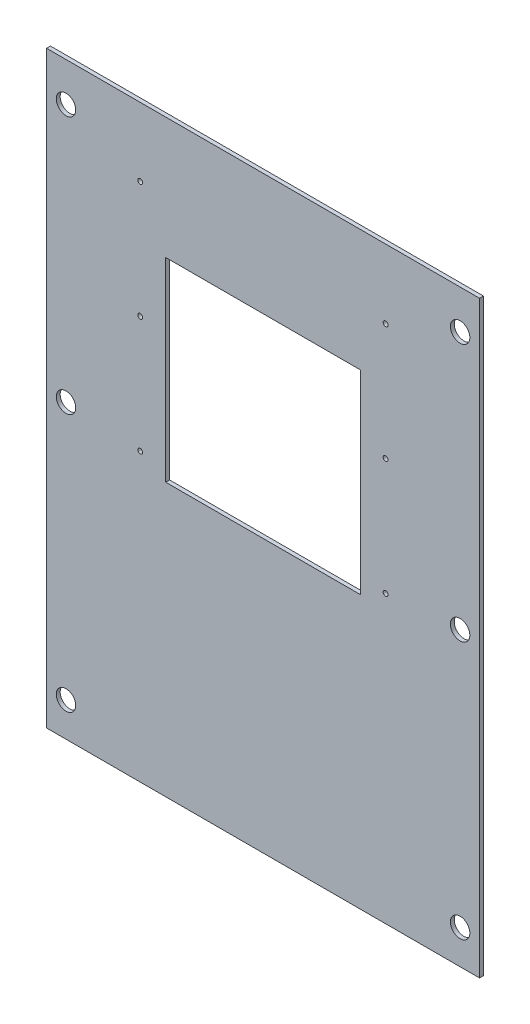
ISO-10303-21;
HEADER;
FILE_DESCRIPTION(('STEP AP214'),'2;1');
FILE_NAME('part.step','',(''),(''),'','','');
FILE_SCHEMA(('AUTOMOTIVE_DESIGN { 1 0 10303 214 1 1 1 1 }'));
ENDSEC;
DATA;
#1=APPLICATION_CONTEXT('core data for automotive mechanical design processes');
#2=APPLICATION_PROTOCOL_DEFINITION('international standard','automotive_design',2000,#1);
#3=PRODUCT_CONTEXT('',#1,'mechanical');
#4=PRODUCT('Part','Part','',(#3));
#5=PRODUCT_RELATED_PRODUCT_CATEGORY('part','',(#4));
#6=PRODUCT_DEFINITION_FORMATION('','',#4);
#7=PRODUCT_DEFINITION_CONTEXT('part definition',#1,'design');
#8=PRODUCT_DEFINITION('design','',#6,#7);
#9=PRODUCT_DEFINITION_SHAPE('','',#8);
#10=(LENGTH_UNIT() NAMED_UNIT(*) SI_UNIT(.MILLI.,.METRE.));
#11=(NAMED_UNIT(*) PLANE_ANGLE_UNIT() SI_UNIT($,.RADIAN.));
#12=(NAMED_UNIT(*) SI_UNIT($,.STERADIAN.) SOLID_ANGLE_UNIT());
#13=UNCERTAINTY_MEASURE_WITH_UNIT(LENGTH_MEASURE(1.E-05),#10,'distance_accuracy_value','');
#14=(GEOMETRIC_REPRESENTATION_CONTEXT(3) GLOBAL_UNCERTAINTY_ASSIGNED_CONTEXT((#13)) GLOBAL_UNIT_ASSIGNED_CONTEXT((#10,
#11,#12)) REPRESENTATION_CONTEXT('',''));
#15=CARTESIAN_POINT('',(0.,0.,0.));
#16=DIRECTION('',(0.,0.,1.));
#17=DIRECTION('',(1.,0.,0.));
#18=AXIS2_PLACEMENT_3D('',#15,#16,#17);
#19=CARTESIAN_POINT('',(141.2875,0.,2.54));
#20=DIRECTION('',(1.,0.,0.));
#21=DIRECTION('',(0.,1.,0.));
#22=AXIS2_PLACEMENT_3D('',#19,#20,#21);
#23=PLANE('',#22);
#24=DIRECTION('',(0.,-1.,0.));
#25=VECTOR('',#24,1.);
#26=CARTESIAN_POINT('',(141.2875,0.,0.));
#27=LINE('',#26,#25);
#28=CARTESIAN_POINT('',(141.2875,192.0875,0.));
#29=VERTEX_POINT('',#28);
#30=CARTESIAN_POINT('',(141.2875,-192.0875,0.));
#31=VERTEX_POINT('',#30);
#32=EDGE_CURVE('E190',#29,#31,#27,.T.);
#33=ORIENTED_EDGE('',*,*,#32,.F.);
#34=DIRECTION('',(0.,0.,-1.));
#35=VECTOR('',#34,1.);
#36=CARTESIAN_POINT('',(141.2875,192.0875,2.54));
#37=LINE('',#36,#35);
#38=CARTESIAN_POINT('',(141.2875,192.0875,2.54));
#39=VERTEX_POINT('',#38);
#40=EDGE_CURVE('E11',#39,#29,#37,.T.);
#41=ORIENTED_EDGE('',*,*,#40,.F.);
#42=DIRECTION('',(0.,-1.,0.));
#43=VECTOR('',#42,1.);
#44=CARTESIAN_POINT('',(141.2875,0.,2.54));
#45=LINE('',#44,#43);
#46=CARTESIAN_POINT('',(141.2875,-192.0875,2.54));
#47=VERTEX_POINT('',#46);
#48=EDGE_CURVE('E134',#39,#47,#45,.T.);
#49=ORIENTED_EDGE('',*,*,#48,.T.);
#50=DIRECTION('',(0.,0.,-1.));
#51=VECTOR('',#50,1.);
#52=CARTESIAN_POINT('',(141.2875,-192.0875,2.54));
#53=LINE('',#52,#51);
#54=EDGE_CURVE('E94',#47,#31,#53,.T.);
#55=ORIENTED_EDGE('',*,*,#54,.T.);
#56=EDGE_LOOP('',(#33,#41,#49,#55));
#57=FACE_BOUND('',#56,.T.);
#58=ADVANCED_FACE('F40',(#57),#23,.T.);
#59=CARTESIAN_POINT('',(0.,192.0875,2.54));
#60=DIRECTION('',(0.,1.,0.));
#61=DIRECTION('',(0.,0.,1.));
#62=AXIS2_PLACEMENT_3D('',#59,#60,#61);
#63=PLANE('',#62);
#64=DIRECTION('',(1.,0.,0.));
#65=VECTOR('',#64,1.);
#66=CARTESIAN_POINT('',(0.,192.0875,0.));
#67=LINE('',#66,#65);
#68=CARTESIAN_POINT('',(-141.2875,192.0875,0.));
#69=VERTEX_POINT('',#68);
#70=EDGE_CURVE('E123',#69,#29,#67,.T.);
#71=ORIENTED_EDGE('',*,*,#70,.F.);
#72=DIRECTION('',(0.,0.,-1.));
#73=VECTOR('',#72,1.);
#74=CARTESIAN_POINT('',(-141.2875,192.0875,2.54));
#75=LINE('',#74,#73);
#76=CARTESIAN_POINT('',(-141.2875,192.0875,2.54));
#77=VERTEX_POINT('',#76);
#78=EDGE_CURVE('E50',#77,#69,#75,.T.);
#79=ORIENTED_EDGE('',*,*,#78,.F.);
#80=DIRECTION('',(1.,0.,0.));
#81=VECTOR('',#80,1.);
#82=CARTESIAN_POINT('',(0.,192.0875,2.54));
#83=LINE('',#82,#81);
#84=EDGE_CURVE('E121',#77,#39,#83,.T.);
#85=ORIENTED_EDGE('',*,*,#84,.T.);
#86=ORIENTED_EDGE('',*,*,#40,.T.);
#87=EDGE_LOOP('',(#71,#79,#85,#86));
#88=FACE_BOUND('',#87,.T.);
#89=ADVANCED_FACE('F119',(#88),#63,.T.);
#90=CARTESIAN_POINT('',(-141.2875,0.,2.54));
#91=DIRECTION('',(1.,0.,0.));
#92=DIRECTION('',(0.,1.,0.));
#93=AXIS2_PLACEMENT_3D('',#90,#91,#92);
#94=PLANE('',#93);
#95=DIRECTION('',(0.,-1.,0.));
#96=VECTOR('',#95,1.);
#97=CARTESIAN_POINT('',(-141.2875,0.,0.));
#98=LINE('',#97,#96);
#99=CARTESIAN_POINT('',(-141.2875,-192.0875,0.));
#100=VERTEX_POINT('',#99);
#101=EDGE_CURVE('E193',#69,#100,#98,.T.);
#102=ORIENTED_EDGE('',*,*,#101,.T.);
#103=DIRECTION('',(0.,0.,-1.));
#104=VECTOR('',#103,1.);
#105=CARTESIAN_POINT('',(-141.2875,-192.0875,2.54));
#106=LINE('',#105,#104);
#107=CARTESIAN_POINT('',(-141.2875,-192.0875,2.54));
#108=VERTEX_POINT('',#107);
#109=EDGE_CURVE('E126',#108,#100,#106,.T.);
#110=ORIENTED_EDGE('',*,*,#109,.F.);
#111=DIRECTION('',(0.,-1.,0.));
#112=VECTOR('',#111,1.);
#113=CARTESIAN_POINT('',(-141.2875,0.,2.54));
#114=LINE('',#113,#112);
#115=EDGE_CURVE('E129',#77,#108,#114,.T.);
#116=ORIENTED_EDGE('',*,*,#115,.F.);
#117=ORIENTED_EDGE('',*,*,#78,.T.);
#118=EDGE_LOOP('',(#102,#110,#116,#117));
#119=FACE_BOUND('',#118,.T.);
#120=ADVANCED_FACE('F130',(#119),#94,.F.);
#121=CARTESIAN_POINT('',(0.,112.7125,2.54));
#122=DIRECTION('',(0.,1.,0.));
#123=DIRECTION('',(0.,0.,1.));
#124=AXIS2_PLACEMENT_3D('',#121,#122,#123);
#125=PLANE('',#124);
#126=DIRECTION('',(1.,0.,0.));
#127=VECTOR('',#126,1.);
#128=CARTESIAN_POINT('',(0.,112.7125,0.));
#129=LINE('',#128,#127);
#130=CARTESIAN_POINT('',(-63.5064023109508,112.7125,0.));
#131=VERTEX_POINT('',#130);
#132=CARTESIAN_POINT('',(63.4935976890492,112.7125,0.));
#133=VERTEX_POINT('',#132);
#134=EDGE_CURVE('E178',#131,#133,#129,.T.);
#135=ORIENTED_EDGE('',*,*,#134,.T.);
#136=DIRECTION('',(0.,0.,-1.));
#137=VECTOR('',#136,1.);
#138=CARTESIAN_POINT('',(63.4935976890492,112.7125,2.54));
#139=LINE('',#138,#137);
#140=CARTESIAN_POINT('',(63.4935976890492,112.7125,2.54));
#141=VERTEX_POINT('',#140);
#142=EDGE_CURVE('E44',#141,#133,#139,.T.);
#143=ORIENTED_EDGE('',*,*,#142,.F.);
#144=DIRECTION('',(1.,0.,0.));
#145=VECTOR('',#144,1.);
#146=CARTESIAN_POINT('',(0.,112.7125,2.54));
#147=LINE('',#146,#145);
#148=CARTESIAN_POINT('',(-63.5064023109508,112.7125,2.54));
#149=VERTEX_POINT('',#148);
#150=EDGE_CURVE('E547',#149,#141,#147,.T.);
#151=ORIENTED_EDGE('',*,*,#150,.F.);
#152=DIRECTION('',(0.,0.,-1.));
#153=VECTOR('',#152,1.);
#154=CARTESIAN_POINT('',(-63.5064023109508,112.7125,2.54));
#155=LINE('',#154,#153);
#156=EDGE_CURVE('E156',#149,#131,#155,.T.);
#157=ORIENTED_EDGE('',*,*,#156,.T.);
#158=EDGE_LOOP('',(#135,#143,#151,#157));
#159=FACE_BOUND('',#158,.T.);
#160=ADVANCED_FACE('F225',(#159),#125,.F.);
#161=CARTESIAN_POINT('',(63.4935976890493,0.,2.54));
#162=DIRECTION('',(1.,0.,0.));
#163=DIRECTION('',(0.,1.,0.));
#164=AXIS2_PLACEMENT_3D('',#161,#162,#163);
#165=PLANE('',#164);
#166=DIRECTION('',(0.,-1.,0.));
#167=VECTOR('',#166,1.);
#168=CARTESIAN_POINT('',(63.4935976890493,0.,0.));
#169=LINE('',#168,#167);
#170=CARTESIAN_POINT('',(63.4935976890493,-14.2875,0.));
#171=VERTEX_POINT('',#170);
#172=EDGE_CURVE('E181',#133,#171,#169,.T.);
#173=ORIENTED_EDGE('',*,*,#172,.T.);
#174=DIRECTION('',(0.,0.,-1.));
#175=VECTOR('',#174,1.);
#176=CARTESIAN_POINT('',(63.4935976890493,-14.2875,2.54));
#177=LINE('',#176,#175);
#178=CARTESIAN_POINT('',(63.4935976890493,-14.2875,2.54));
#179=VERTEX_POINT('',#178);
#180=EDGE_CURVE('E216',#179,#171,#177,.T.);
#181=ORIENTED_EDGE('',*,*,#180,.F.);
#182=DIRECTION('',(0.,-1.,0.));
#183=VECTOR('',#182,1.);
#184=CARTESIAN_POINT('',(63.4935976890493,0.,2.54));
#185=LINE('',#184,#183);
#186=EDGE_CURVE('E102',#141,#179,#185,.T.);
#187=ORIENTED_EDGE('',*,*,#186,.F.);
#188=ORIENTED_EDGE('',*,*,#142,.T.);
#189=EDGE_LOOP('',(#173,#181,#187,#188));
#190=FACE_BOUND('',#189,.T.);
#191=ADVANCED_FACE('F221',(#190),#165,.F.);
#192=CARTESIAN_POINT('',(0.,-14.2875,2.54));
#193=DIRECTION('',(0.,1.,0.));
#194=DIRECTION('',(0.,0.,1.));
#195=AXIS2_PLACEMENT_3D('',#192,#193,#194);
#196=PLANE('',#195);
#197=DIRECTION('',(1.,0.,0.));
#198=VECTOR('',#197,1.);
#199=CARTESIAN_POINT('',(0.,-14.2875,0.));
#200=LINE('',#199,#198);
#201=CARTESIAN_POINT('',(-63.5064023109508,-14.2875,0.));
#202=VERTEX_POINT('',#201);
#203=EDGE_CURVE('E184',#202,#171,#200,.T.);
#204=ORIENTED_EDGE('',*,*,#203,.F.);
#205=DIRECTION('',(0.,0.,-1.));
#206=VECTOR('',#205,1.);
#207=CARTESIAN_POINT('',(-63.5064023109508,-14.2875,2.54));
#208=LINE('',#207,#206);
#209=CARTESIAN_POINT('',(-63.5064023109508,-14.2875,2.54));
#210=VERTEX_POINT('',#209);
#211=EDGE_CURVE('E215',#210,#202,#208,.T.);
#212=ORIENTED_EDGE('',*,*,#211,.F.);
#213=DIRECTION('',(1.,0.,0.));
#214=VECTOR('',#213,1.);
#215=CARTESIAN_POINT('',(0.,-14.2875,2.54));
#216=LINE('',#215,#214);
#217=EDGE_CURVE('E549',#210,#179,#216,.T.);
#218=ORIENTED_EDGE('',*,*,#217,.T.);
#219=ORIENTED_EDGE('',*,*,#180,.T.);
#220=EDGE_LOOP('',(#204,#212,#218,#219));
#221=FACE_BOUND('',#220,.T.);
#222=ADVANCED_FACE('F234',(#221),#196,.T.);
#223=CARTESIAN_POINT('',(128.5875,-1.58749999999996,2.54));
#224=DIRECTION('',(0.,0.,-1.));
#225=DIRECTION('',(-1.,0.,0.));
#226=AXIS2_PLACEMENT_3D('',#223,#224,#225);
#227=CYLINDRICAL_SURFACE('',#226,6.35);
#228=CARTESIAN_POINT('',(128.5875,-1.58749999999996,2.54));
#229=DIRECTION('',(0.,0.,1.));
#230=DIRECTION('',(1.,0.,0.));
#231=AXIS2_PLACEMENT_3D('',#228,#229,#230);
#232=CIRCLE('',#231,6.35);
#233=CARTESIAN_POINT('',(134.9375,-1.58749999999996,2.54));
#234=VERTEX_POINT('',#233);
#235=EDGE_CURVE('E150',#234,#234,#232,.F.);
#236=ORIENTED_EDGE('',*,*,#235,.F.);
#237=EDGE_LOOP('',(#236));
#238=FACE_BOUND('',#237,.T.);
#239=CARTESIAN_POINT('',(128.5875,-1.58749999999996,0.));
#240=DIRECTION('',(0.,0.,1.));
#241=DIRECTION('',(1.,0.,0.));
#242=AXIS2_PLACEMENT_3D('',#239,#240,#241);
#243=CIRCLE('',#242,6.35);
#244=CARTESIAN_POINT('',(134.9375,-1.58749999999996,0.));
#245=VERTEX_POINT('',#244);
#246=EDGE_CURVE('E205',#245,#245,#243,.F.);
#247=ORIENTED_EDGE('',*,*,#246,.T.);
#248=EDGE_LOOP('',(#247));
#249=FACE_BOUND('',#248,.T.);
#250=ADVANCED_FACE('F236',(#238,#249),#227,.F.);
#251=CARTESIAN_POINT('',(-128.5875,-169.8625,2.54));
#252=DIRECTION('',(0.,0.,-1.));
#253=DIRECTION('',(-1.,0.,0.));
#254=AXIS2_PLACEMENT_3D('',#251,#252,#253);
#255=CYLINDRICAL_SURFACE('',#254,6.34999999999999);
#256=CARTESIAN_POINT('',(-128.5875,-169.8625,2.54));
#257=DIRECTION('',(0.,0.,1.));
#258=DIRECTION('',(1.,0.,0.));
#259=AXIS2_PLACEMENT_3D('',#256,#257,#258);
#260=CIRCLE('',#259,6.34999999999999);
#261=CARTESIAN_POINT('',(-122.2375,-169.8625,2.54));
#262=VERTEX_POINT('',#261);
#263=EDGE_CURVE('E147',#262,#262,#260,.T.);
#264=ORIENTED_EDGE('',*,*,#263,.T.);
#265=EDGE_LOOP('',(#264));
#266=FACE_BOUND('',#265,.T.);
#267=CARTESIAN_POINT('',(-128.5875,-169.8625,0.));
#268=DIRECTION('',(0.,0.,1.));
#269=DIRECTION('',(1.,0.,0.));
#270=AXIS2_PLACEMENT_3D('',#267,#268,#269);
#271=CIRCLE('',#270,6.34999999999999);
#272=CARTESIAN_POINT('',(-122.2375,-169.8625,0.));
#273=VERTEX_POINT('',#272);
#274=EDGE_CURVE('E202',#273,#273,#271,.T.);
#275=ORIENTED_EDGE('',*,*,#274,.F.);
#276=EDGE_LOOP('',(#275));
#277=FACE_BOUND('',#276,.T.);
#278=ADVANCED_FACE('F242',(#266,#277),#255,.F.);
#279=CARTESIAN_POINT('',(-128.5875,-1.58750000000002,2.54));
#280=DIRECTION('',(0.,0.,-1.));
#281=DIRECTION('',(-1.,0.,0.));
#282=AXIS2_PLACEMENT_3D('',#279,#280,#281);
#283=CYLINDRICAL_SURFACE('',#282,6.35);
#284=CARTESIAN_POINT('',(-128.5875,-1.58750000000002,2.54));
#285=DIRECTION('',(0.,0.,1.));
#286=DIRECTION('',(1.,0.,0.));
#287=AXIS2_PLACEMENT_3D('',#284,#285,#286);
#288=CIRCLE('',#287,6.35);
#289=CARTESIAN_POINT('',(-122.2375,-1.58750000000002,2.54));
#290=VERTEX_POINT('',#289);
#291=EDGE_CURVE('E144',#290,#290,#288,.T.);
#292=ORIENTED_EDGE('',*,*,#291,.T.);
#293=EDGE_LOOP('',(#292));
#294=FACE_BOUND('',#293,.T.);
#295=CARTESIAN_POINT('',(-128.5875,-1.58750000000002,0.));
#296=DIRECTION('',(0.,0.,1.));
#297=DIRECTION('',(1.,0.,0.));
#298=AXIS2_PLACEMENT_3D('',#295,#296,#297);
#299=CIRCLE('',#298,6.35);
#300=CARTESIAN_POINT('',(-122.2375,-1.58750000000002,0.));
#301=VERTEX_POINT('',#300);
#302=EDGE_CURVE('E199',#301,#301,#299,.T.);
#303=ORIENTED_EDGE('',*,*,#302,.F.);
#304=EDGE_LOOP('',(#303));
#305=FACE_BOUND('',#304,.T.);
#306=ADVANCED_FACE('F270',(#294,#305),#283,.F.);
#307=CARTESIAN_POINT('',(-128.5875,166.6875,2.54));
#308=DIRECTION('',(0.,0.,-1.));
#309=DIRECTION('',(-1.,0.,0.));
#310=AXIS2_PLACEMENT_3D('',#307,#308,#309);
#311=CYLINDRICAL_SURFACE('',#310,6.34999999999999);
#312=CARTESIAN_POINT('',(-128.5875,166.6875,2.54));
#313=DIRECTION('',(0.,0.,1.));
#314=DIRECTION('',(1.,0.,0.));
#315=AXIS2_PLACEMENT_3D('',#312,#313,#314);
#316=CIRCLE('',#315,6.34999999999999);
#317=CARTESIAN_POINT('',(-122.2375,166.6875,2.54));
#318=VERTEX_POINT('',#317);
#319=EDGE_CURVE('E141',#318,#318,#316,.T.);
#320=ORIENTED_EDGE('',*,*,#319,.T.);
#321=EDGE_LOOP('',(#320));
#322=FACE_BOUND('',#321,.T.);
#323=CARTESIAN_POINT('',(-128.5875,166.6875,0.));
#324=DIRECTION('',(0.,0.,1.));
#325=DIRECTION('',(1.,0.,0.));
#326=AXIS2_PLACEMENT_3D('',#323,#324,#325);
#327=CIRCLE('',#326,6.34999999999999);
#328=CARTESIAN_POINT('',(-122.2375,166.6875,0.));
#329=VERTEX_POINT('',#328);
#330=EDGE_CURVE('E196',#329,#329,#327,.T.);
#331=ORIENTED_EDGE('',*,*,#330,.F.);
#332=EDGE_LOOP('',(#331));
#333=FACE_BOUND('',#332,.T.);
#334=ADVANCED_FACE('F264',(#322,#333),#311,.F.);
#335=CARTESIAN_POINT('',(0.,-192.0875,2.54));
#336=DIRECTION('',(0.,1.,0.));
#337=DIRECTION('',(0.,0.,1.));
#338=AXIS2_PLACEMENT_3D('',#335,#336,#337);
#339=PLANE('',#338);
#340=DIRECTION('',(1.,0.,0.));
#341=VECTOR('',#340,1.);
#342=CARTESIAN_POINT('',(0.,-192.0875,0.));
#343=LINE('',#342,#341);
#344=EDGE_CURVE('E87',#100,#31,#343,.T.);
#345=ORIENTED_EDGE('',*,*,#344,.T.);
#346=ORIENTED_EDGE('',*,*,#54,.F.);
#347=DIRECTION('',(1.,0.,0.));
#348=VECTOR('',#347,1.);
#349=CARTESIAN_POINT('',(0.,-192.0875,2.54));
#350=LINE('',#349,#348);
#351=EDGE_CURVE('E59',#108,#47,#350,.T.);
#352=ORIENTED_EDGE('',*,*,#351,.F.);
#353=ORIENTED_EDGE('',*,*,#109,.T.);
#354=EDGE_LOOP('',(#345,#346,#352,#353));
#355=FACE_BOUND('',#354,.T.);
#356=ADVANCED_FACE('F256',(#355),#339,.F.);
#357=CARTESIAN_POINT('',(-63.5064023109508,0.,2.54));
#358=DIRECTION('',(1.,0.,0.));
#359=DIRECTION('',(0.,0.,-1.));
#360=AXIS2_PLACEMENT_3D('',#357,#358,#359);
#361=PLANE('',#360);
#362=DIRECTION('',(0.,-1.,0.));
#363=VECTOR('',#362,1.);
#364=CARTESIAN_POINT('',(-63.5064023109508,0.,0.));
#365=LINE('',#364,#363);
#366=EDGE_CURVE('E187',#131,#202,#365,.T.);
#367=ORIENTED_EDGE('',*,*,#366,.F.);
#368=ORIENTED_EDGE('',*,*,#156,.F.);
#369=DIRECTION('',(0.,-1.,0.));
#370=VECTOR('',#369,1.);
#371=CARTESIAN_POINT('',(-63.5064023109508,0.,2.54));
#372=LINE('',#371,#370);
#373=EDGE_CURVE('E136',#149,#210,#372,.T.);
#374=ORIENTED_EDGE('',*,*,#373,.T.);
#375=ORIENTED_EDGE('',*,*,#211,.T.);
#376=EDGE_LOOP('',(#367,#368,#374,#375));
#377=FACE_BOUND('',#376,.T.);
#378=ADVANCED_FACE('F230',(#377),#361,.T.);
#379=CARTESIAN_POINT('',(128.5875,166.6875,2.54));
#380=DIRECTION('',(0.,0.,-1.));
#381=DIRECTION('',(-1.,0.,0.));
#382=AXIS2_PLACEMENT_3D('',#379,#380,#381);
#383=CYLINDRICAL_SURFACE('',#382,6.34999999999999);
#384=CARTESIAN_POINT('',(128.5875,166.6875,2.54));
#385=DIRECTION('',(0.,0.,1.));
#386=DIRECTION('',(1.,0.,0.));
#387=AXIS2_PLACEMENT_3D('',#384,#385,#386);
#388=CIRCLE('',#387,6.34999999999999);
#389=CARTESIAN_POINT('',(134.9375,166.6875,2.54));
#390=VERTEX_POINT('',#389);
#391=EDGE_CURVE('E546',#390,#390,#388,.F.);
#392=ORIENTED_EDGE('',*,*,#391,.F.);
#393=EDGE_LOOP('',(#392));
#394=FACE_BOUND('',#393,.T.);
#395=CARTESIAN_POINT('',(128.5875,166.6875,0.));
#396=DIRECTION('',(0.,0.,1.));
#397=DIRECTION('',(1.,0.,0.));
#398=AXIS2_PLACEMENT_3D('',#395,#396,#397);
#399=CIRCLE('',#398,6.34999999999999);
#400=CARTESIAN_POINT('',(134.9375,166.6875,0.));
#401=VERTEX_POINT('',#400);
#402=EDGE_CURVE('E175',#401,#401,#399,.F.);
#403=ORIENTED_EDGE('',*,*,#402,.T.);
#404=EDGE_LOOP('',(#403));
#405=FACE_BOUND('',#404,.T.);
#406=ADVANCED_FACE('F255',(#394,#405),#383,.F.);
#407=CARTESIAN_POINT('',(-80.1751523109518,147.376386757124,2.54));
#408=DIRECTION('',(0.,0.,-1.));
#409=DIRECTION('',(-1.,0.,0.));
#410=AXIS2_PLACEMENT_3D('',#407,#408,#409);
#411=CYLINDRICAL_SURFACE('',#410,1.58750000005452);
#412=CARTESIAN_POINT('',(-80.1751523109518,147.376386757124,2.54));
#413=DIRECTION('',(0.,0.,1.));
#414=DIRECTION('',(1.,0.,0.));
#415=AXIS2_PLACEMENT_3D('',#412,#413,#414);
#416=CIRCLE('',#415,1.58750000005452);
#417=CARTESIAN_POINT('',(-78.5876523108973,147.376386757124,2.54));
#418=VERTEX_POINT('',#417);
#419=EDGE_CURVE('E542',#418,#418,#416,.T.);
#420=ORIENTED_EDGE('',*,*,#419,.T.);
#421=EDGE_LOOP('',(#420));
#422=FACE_BOUND('',#421,.T.);
#423=CARTESIAN_POINT('',(-80.1751523109518,147.376386757124,0.));
#424=DIRECTION('',(0.,0.,1.));
#425=DIRECTION('',(1.,0.,0.));
#426=AXIS2_PLACEMENT_3D('',#423,#424,#425);
#427=CIRCLE('',#426,1.58750000005452);
#428=CARTESIAN_POINT('',(-78.5876523108973,147.376386757124,0.));
#429=VERTEX_POINT('',#428);
#430=EDGE_CURVE('E172',#429,#429,#427,.T.);
#431=ORIENTED_EDGE('',*,*,#430,.F.);
#432=EDGE_LOOP('',(#431));
#433=FACE_BOUND('',#432,.T.);
#434=ADVANCED_FACE('F261',(#422,#433),#411,.F.);
#435=CARTESIAN_POINT('',(-80.1751523109513,71.1763867571244,2.54));
#436=DIRECTION('',(0.,0.,-1.));
#437=DIRECTION('',(-1.,0.,0.));
#438=AXIS2_PLACEMENT_3D('',#435,#436,#437);
#439=CYLINDRICAL_SURFACE('',#438,1.5875000000545);
#440=CARTESIAN_POINT('',(-80.1751523109513,71.1763867571244,2.54));
#441=DIRECTION('',(0.,0.,1.));
#442=DIRECTION('',(1.,0.,0.));
#443=AXIS2_PLACEMENT_3D('',#440,#441,#442);
#444=CIRCLE('',#443,1.5875000000545);
#445=CARTESIAN_POINT('',(-78.5876523108968,71.1763867571244,2.54));
#446=VERTEX_POINT('',#445);
#447=EDGE_CURVE('E538',#446,#446,#444,.T.);
#448=ORIENTED_EDGE('',*,*,#447,.T.);
#449=EDGE_LOOP('',(#448));
#450=FACE_BOUND('',#449,.T.);
#451=CARTESIAN_POINT('',(-80.1751523109513,71.1763867571244,0.));
#452=DIRECTION('',(0.,0.,1.));
#453=DIRECTION('',(1.,0.,0.));
#454=AXIS2_PLACEMENT_3D('',#451,#452,#453);
#455=CIRCLE('',#454,1.5875000000545);
#456=CARTESIAN_POINT('',(-78.5876523108968,71.1763867571244,0.));
#457=VERTEX_POINT('',#456);
#458=EDGE_CURVE('E169',#457,#457,#455,.T.);
#459=ORIENTED_EDGE('',*,*,#458,.F.);
#460=EDGE_LOOP('',(#459));
#461=FACE_BOUND('',#460,.T.);
#462=ADVANCED_FACE('F284',(#450,#461),#439,.F.);
#463=CARTESIAN_POINT('',(-80.1751523109507,-5.02361324287556,2.54));
#464=DIRECTION('',(0.,0.,-1.));
#465=DIRECTION('',(-1.,0.,0.));
#466=AXIS2_PLACEMENT_3D('',#463,#464,#465);
#467=CYLINDRICAL_SURFACE('',#466,1.58750000005448);
#468=CARTESIAN_POINT('',(-80.1751523109507,-5.02361324287556,2.54));
#469=DIRECTION('',(0.,0.,1.));
#470=DIRECTION('',(1.,0.,0.));
#471=AXIS2_PLACEMENT_3D('',#468,#469,#470);
#472=CIRCLE('',#471,1.58750000005448);
#473=CARTESIAN_POINT('',(-78.5876523108962,-5.02361324287556,2.54));
#474=VERTEX_POINT('',#473);
#475=EDGE_CURVE('E534',#474,#474,#472,.T.);
#476=ORIENTED_EDGE('',*,*,#475,.T.);
#477=EDGE_LOOP('',(#476));
#478=FACE_BOUND('',#477,.T.);
#479=CARTESIAN_POINT('',(-80.1751523109507,-5.02361324287556,0.));
#480=DIRECTION('',(0.,0.,1.));
#481=DIRECTION('',(1.,0.,0.));
#482=AXIS2_PLACEMENT_3D('',#479,#480,#481);
#483=CIRCLE('',#482,1.58750000005448);
#484=CARTESIAN_POINT('',(-78.5876523108962,-5.02361324287556,0.));
#485=VERTEX_POINT('',#484);
#486=EDGE_CURVE('E166',#485,#485,#483,.T.);
#487=ORIENTED_EDGE('',*,*,#486,.F.);
#488=EDGE_LOOP('',(#487));
#489=FACE_BOUND('',#488,.T.);
#490=ADVANCED_FACE('F288',(#478,#489),#467,.F.);
#491=CARTESIAN_POINT('',(79.9706504994258,-5.39516449430694,2.54));
#492=DIRECTION('',(0.,0.,-1.));
#493=DIRECTION('',(-1.,0.,0.));
#494=AXIS2_PLACEMENT_3D('',#491,#492,#493);
#495=CYLINDRICAL_SURFACE('',#494,1.58749999999999);
#496=CARTESIAN_POINT('',(79.9706504994258,-5.39516449430694,2.54));
#497=DIRECTION('',(0.,0.,1.));
#498=DIRECTION('',(1.,0.,0.));
#499=AXIS2_PLACEMENT_3D('',#496,#497,#498);
#500=CIRCLE('',#499,1.58749999999999);
#501=CARTESIAN_POINT('',(81.5581504994258,-5.39516449430694,2.54));
#502=VERTEX_POINT('',#501);
#503=EDGE_CURVE('E530',#502,#502,#500,.T.);
#504=ORIENTED_EDGE('',*,*,#503,.T.);
#505=EDGE_LOOP('',(#504));
#506=FACE_BOUND('',#505,.T.);
#507=CARTESIAN_POINT('',(79.9706504994258,-5.39516449430694,0.));
#508=DIRECTION('',(0.,0.,1.));
#509=DIRECTION('',(1.,0.,0.));
#510=AXIS2_PLACEMENT_3D('',#507,#508,#509);
#511=CIRCLE('',#510,1.58749999999999);
#512=CARTESIAN_POINT('',(81.5581504994258,-5.39516449430694,0.));
#513=VERTEX_POINT('',#512);
#514=EDGE_CURVE('E163',#513,#513,#511,.T.);
#515=ORIENTED_EDGE('',*,*,#514,.F.);
#516=EDGE_LOOP('',(#515));
#517=FACE_BOUND('',#516,.T.);
#518=ADVANCED_FACE('F292',(#506,#517),#495,.F.);
#519=CARTESIAN_POINT('',(79.9706504994258,70.804835505693,2.54));
#520=DIRECTION('',(0.,0.,-1.));
#521=DIRECTION('',(-1.,0.,0.));
#522=AXIS2_PLACEMENT_3D('',#519,#520,#521);
#523=CYLINDRICAL_SURFACE('',#522,1.58749999999999);
#524=CARTESIAN_POINT('',(79.9706504994258,70.804835505693,2.54));
#525=DIRECTION('',(0.,0.,1.));
#526=DIRECTION('',(1.,0.,0.));
#527=AXIS2_PLACEMENT_3D('',#524,#525,#526);
#528=CIRCLE('',#527,1.58749999999999);
#529=CARTESIAN_POINT('',(81.5581504994258,70.804835505693,2.54));
#530=VERTEX_POINT('',#529);
#531=EDGE_CURVE('E307',#530,#530,#528,.T.);
#532=ORIENTED_EDGE('',*,*,#531,.T.);
#533=EDGE_LOOP('',(#532));
#534=FACE_BOUND('',#533,.T.);
#535=CARTESIAN_POINT('',(79.9706504994258,70.804835505693,0.));
#536=DIRECTION('',(0.,0.,1.));
#537=DIRECTION('',(1.,0.,0.));
#538=AXIS2_PLACEMENT_3D('',#535,#536,#537);
#539=CIRCLE('',#538,1.58749999999999);
#540=CARTESIAN_POINT('',(81.5581504994258,70.804835505693,0.));
#541=VERTEX_POINT('',#540);
#542=EDGE_CURVE('E160',#541,#541,#539,.T.);
#543=ORIENTED_EDGE('',*,*,#542,.F.);
#544=EDGE_LOOP('',(#543));
#545=FACE_BOUND('',#544,.T.);
#546=ADVANCED_FACE('F295',(#534,#545),#523,.F.);
#547=CARTESIAN_POINT('',(79.9706504994258,147.004835505693,2.54));
#548=DIRECTION('',(0.,0.,-1.));
#549=DIRECTION('',(-1.,0.,0.));
#550=AXIS2_PLACEMENT_3D('',#547,#548,#549);
#551=CYLINDRICAL_SURFACE('',#550,1.58749999999999);
#552=CARTESIAN_POINT('',(79.9706504994258,147.004835505693,2.54));
#553=DIRECTION('',(0.,0.,1.));
#554=DIRECTION('',(1.,0.,0.));
#555=AXIS2_PLACEMENT_3D('',#552,#553,#554);
#556=CIRCLE('',#555,1.58749999999999);
#557=CARTESIAN_POINT('',(81.5581504994258,147.004835505693,2.54));
#558=VERTEX_POINT('',#557);
#559=EDGE_CURVE('E211',#558,#558,#556,.T.);
#560=ORIENTED_EDGE('',*,*,#559,.T.);
#561=EDGE_LOOP('',(#560));
#562=FACE_BOUND('',#561,.T.);
#563=CARTESIAN_POINT('',(79.9706504994258,147.004835505693,0.));
#564=DIRECTION('',(0.,0.,1.));
#565=DIRECTION('',(1.,0.,0.));
#566=AXIS2_PLACEMENT_3D('',#563,#564,#565);
#567=CIRCLE('',#566,1.58749999999999);
#568=CARTESIAN_POINT('',(81.5581504994258,147.004835505693,0.));
#569=VERTEX_POINT('',#568);
#570=EDGE_CURVE('E157',#569,#569,#567,.T.);
#571=ORIENTED_EDGE('',*,*,#570,.F.);
#572=EDGE_LOOP('',(#571));
#573=FACE_BOUND('',#572,.T.);
#574=ADVANCED_FACE('F42',(#562,#573),#551,.F.);
#575=CARTESIAN_POINT('',(128.5875,-169.8625,2.54));
#576=DIRECTION('',(0.,0.,-1.));
#577=DIRECTION('',(-1.,0.,0.));
#578=AXIS2_PLACEMENT_3D('',#575,#576,#577);
#579=CYLINDRICAL_SURFACE('',#578,6.34999999999999);
#580=CARTESIAN_POINT('',(128.5875,-169.8625,2.54));
#581=DIRECTION('',(0.,0.,1.));
#582=DIRECTION('',(1.,0.,0.));
#583=AXIS2_PLACEMENT_3D('',#580,#581,#582);
#584=CIRCLE('',#583,6.34999999999999);
#585=CARTESIAN_POINT('',(134.9375,-169.8625,2.54));
#586=VERTEX_POINT('',#585);
#587=EDGE_CURVE('E153',#586,#586,#584,.F.);
#588=ORIENTED_EDGE('',*,*,#587,.F.);
#589=EDGE_LOOP('',(#588));
#590=FACE_BOUND('',#589,.T.);
#591=CARTESIAN_POINT('',(128.5875,-169.8625,0.));
#592=DIRECTION('',(0.,0.,1.));
#593=DIRECTION('',(1.,0.,0.));
#594=AXIS2_PLACEMENT_3D('',#591,#592,#593);
#595=CIRCLE('',#594,6.34999999999999);
#596=CARTESIAN_POINT('',(134.9375,-169.8625,0.));
#597=VERTEX_POINT('',#596);
#598=EDGE_CURVE('E208',#597,#597,#595,.F.);
#599=ORIENTED_EDGE('',*,*,#598,.T.);
#600=EDGE_LOOP('',(#599));
#601=FACE_BOUND('',#600,.T.);
#602=ADVANCED_FACE('F302',(#590,#601),#579,.F.);
#603=CARTESIAN_POINT('',(0.,0.,2.54));
#604=DIRECTION('',(0.,0.,1.));
#605=DIRECTION('',(1.,0.,0.));
#606=AXIS2_PLACEMENT_3D('',#603,#604,#605);
#607=PLANE('',#606);
#608=ORIENTED_EDGE('',*,*,#559,.F.);
#609=EDGE_LOOP('',(#608));
#610=FACE_BOUND('',#609,.T.);
#611=ORIENTED_EDGE('',*,*,#531,.F.);
#612=EDGE_LOOP('',(#611));
#613=FACE_BOUND('',#612,.T.);
#614=ORIENTED_EDGE('',*,*,#503,.F.);
#615=EDGE_LOOP('',(#614));
#616=FACE_BOUND('',#615,.T.);
#617=ORIENTED_EDGE('',*,*,#475,.F.);
#618=EDGE_LOOP('',(#617));
#619=FACE_BOUND('',#618,.T.);
#620=ORIENTED_EDGE('',*,*,#447,.F.);
#621=EDGE_LOOP('',(#620));
#622=FACE_BOUND('',#621,.T.);
#623=ORIENTED_EDGE('',*,*,#419,.F.);
#624=EDGE_LOOP('',(#623));
#625=FACE_BOUND('',#624,.T.);
#626=ORIENTED_EDGE('',*,*,#391,.T.);
#627=EDGE_LOOP('',(#626));
#628=FACE_BOUND('',#627,.T.);
#629=ORIENTED_EDGE('',*,*,#150,.T.);
#630=ORIENTED_EDGE('',*,*,#186,.T.);
#631=ORIENTED_EDGE('',*,*,#217,.F.);
#632=ORIENTED_EDGE('',*,*,#373,.F.);
#633=EDGE_LOOP('',(#629,#630,#631,#632));
#634=FACE_BOUND('',#633,.T.);
#635=ORIENTED_EDGE('',*,*,#48,.F.);
#636=ORIENTED_EDGE('',*,*,#84,.F.);
#637=ORIENTED_EDGE('',*,*,#115,.T.);
#638=ORIENTED_EDGE('',*,*,#351,.T.);
#639=EDGE_LOOP('',(#635,#636,#637,#638));
#640=FACE_BOUND('',#639,.T.);
#641=ORIENTED_EDGE('',*,*,#319,.F.);
#642=EDGE_LOOP('',(#641));
#643=FACE_BOUND('',#642,.T.);
#644=ORIENTED_EDGE('',*,*,#291,.F.);
#645=EDGE_LOOP('',(#644));
#646=FACE_BOUND('',#645,.T.);
#647=ORIENTED_EDGE('',*,*,#263,.F.);
#648=EDGE_LOOP('',(#647));
#649=FACE_BOUND('',#648,.T.);
#650=ORIENTED_EDGE('',*,*,#235,.T.);
#651=EDGE_LOOP('',(#650));
#652=FACE_BOUND('',#651,.T.);
#653=ORIENTED_EDGE('',*,*,#587,.T.);
#654=EDGE_LOOP('',(#653));
#655=FACE_BOUND('',#654,.T.);
#656=ADVANCED_FACE('F132',(#610,#613,#616,#619,#622,#625,#628,#634,#640,#643,#646,#649,#652,
#655),#607,.T.);
#657=CARTESIAN_POINT('',(0.,0.,0.));
#658=DIRECTION('',(0.,0.,1.));
#659=DIRECTION('',(1.,0.,0.));
#660=AXIS2_PLACEMENT_3D('',#657,#658,#659);
#661=PLANE('',#660);
#662=ORIENTED_EDGE('',*,*,#570,.T.);
#663=EDGE_LOOP('',(#662));
#664=FACE_BOUND('',#663,.T.);
#665=ORIENTED_EDGE('',*,*,#542,.T.);
#666=EDGE_LOOP('',(#665));
#667=FACE_BOUND('',#666,.T.);
#668=ORIENTED_EDGE('',*,*,#514,.T.);
#669=EDGE_LOOP('',(#668));
#670=FACE_BOUND('',#669,.T.);
#671=ORIENTED_EDGE('',*,*,#486,.T.);
#672=EDGE_LOOP('',(#671));
#673=FACE_BOUND('',#672,.T.);
#674=ORIENTED_EDGE('',*,*,#458,.T.);
#675=EDGE_LOOP('',(#674));
#676=FACE_BOUND('',#675,.T.);
#677=ORIENTED_EDGE('',*,*,#430,.T.);
#678=EDGE_LOOP('',(#677));
#679=FACE_BOUND('',#678,.T.);
#680=ORIENTED_EDGE('',*,*,#402,.F.);
#681=EDGE_LOOP('',(#680));
#682=FACE_BOUND('',#681,.T.);
#683=ORIENTED_EDGE('',*,*,#134,.F.);
#684=ORIENTED_EDGE('',*,*,#366,.T.);
#685=ORIENTED_EDGE('',*,*,#203,.T.);
#686=ORIENTED_EDGE('',*,*,#172,.F.);
#687=EDGE_LOOP('',(#683,#684,#685,#686));
#688=FACE_BOUND('',#687,.T.);
#689=ORIENTED_EDGE('',*,*,#32,.T.);
#690=ORIENTED_EDGE('',*,*,#344,.F.);
#691=ORIENTED_EDGE('',*,*,#101,.F.);
#692=ORIENTED_EDGE('',*,*,#70,.T.);
#693=EDGE_LOOP('',(#689,#690,#691,#692));
#694=FACE_BOUND('',#693,.T.);
#695=ORIENTED_EDGE('',*,*,#330,.T.);
#696=EDGE_LOOP('',(#695));
#697=FACE_BOUND('',#696,.T.);
#698=ORIENTED_EDGE('',*,*,#302,.T.);
#699=EDGE_LOOP('',(#698));
#700=FACE_BOUND('',#699,.T.);
#701=ORIENTED_EDGE('',*,*,#274,.T.);
#702=EDGE_LOOP('',(#701));
#703=FACE_BOUND('',#702,.T.);
#704=ORIENTED_EDGE('',*,*,#246,.F.);
#705=EDGE_LOOP('',(#704));
#706=FACE_BOUND('',#705,.T.);
#707=ORIENTED_EDGE('',*,*,#598,.F.);
#708=EDGE_LOOP('',(#707));
#709=FACE_BOUND('',#708,.T.);
#710=ADVANCED_FACE('F228',(#664,#667,#670,#673,#676,#679,#682,#688,#694,#697,#700,#703,#706,
#709),#661,.F.);
#711=CLOSED_SHELL('',(#58,#89,#120,#160,#191,#222,#250,#278,#306,#334,#356,#378,#406,#434,#462,
#490,#518,#546,#574,#602,#656,#710));
#712=MANIFOLD_SOLID_BREP('B2',#711);
#713=ADVANCED_BREP_SHAPE_REPRESENTATION('',(#18,#712),#14);
#714=SHAPE_DEFINITION_REPRESENTATION(#9,#713);
ENDSEC;
END-ISO-10303-21;
